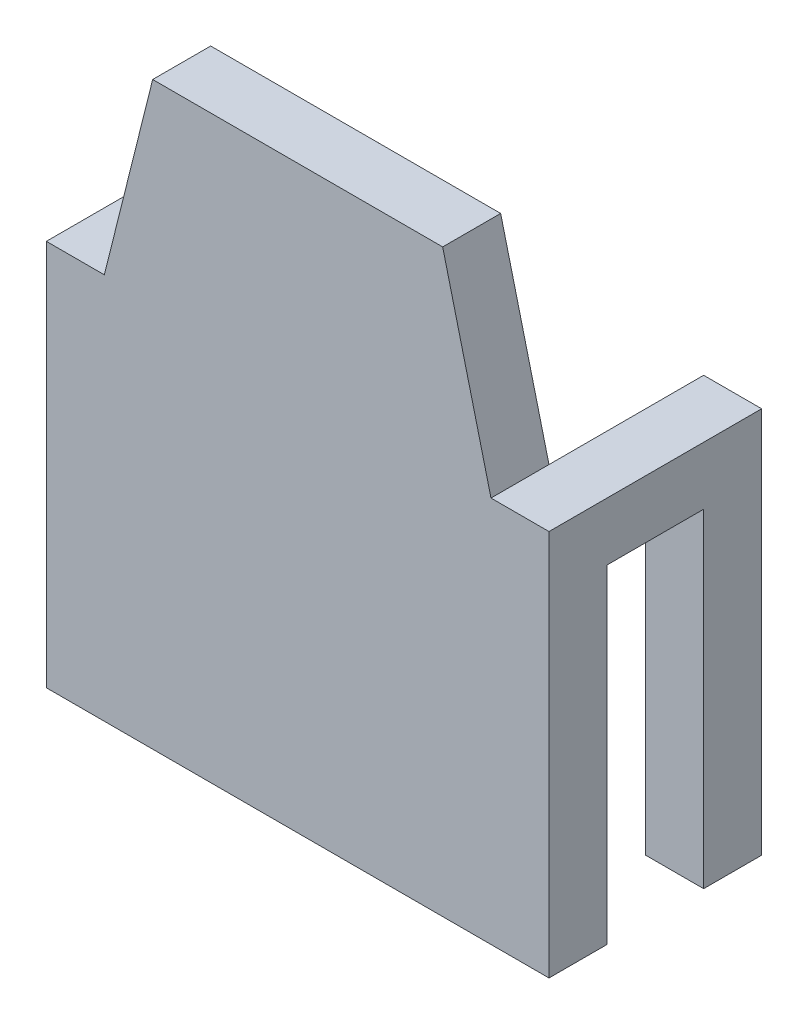
ISO-10303-21;
HEADER;
FILE_DESCRIPTION(('STEP AP214'),'2;1');
FILE_NAME('part.step','',(''),(''),'','','');
FILE_SCHEMA(('AUTOMOTIVE_DESIGN { 1 0 10303 214 1 1 1 1 }'));
ENDSEC;
DATA;
#1=APPLICATION_CONTEXT('core data for automotive mechanical design processes');
#2=APPLICATION_PROTOCOL_DEFINITION('international standard','automotive_design',2000,#1);
#3=PRODUCT_CONTEXT('',#1,'mechanical');
#4=PRODUCT('Part','Part','',(#3));
#5=PRODUCT_RELATED_PRODUCT_CATEGORY('part','',(#4));
#6=PRODUCT_DEFINITION_FORMATION('','',#4);
#7=PRODUCT_DEFINITION_CONTEXT('part definition',#1,'design');
#8=PRODUCT_DEFINITION('design','',#6,#7);
#9=PRODUCT_DEFINITION_SHAPE('','',#8);
#10=(LENGTH_UNIT() NAMED_UNIT(*) SI_UNIT(.MILLI.,.METRE.));
#11=(NAMED_UNIT(*) PLANE_ANGLE_UNIT() SI_UNIT($,.RADIAN.));
#12=(NAMED_UNIT(*) SI_UNIT($,.STERADIAN.) SOLID_ANGLE_UNIT());
#13=UNCERTAINTY_MEASURE_WITH_UNIT(LENGTH_MEASURE(1.E-05),#10,'distance_accuracy_value','');
#14=(GEOMETRIC_REPRESENTATION_CONTEXT(3) GLOBAL_UNCERTAINTY_ASSIGNED_CONTEXT((#13)) GLOBAL_UNIT_ASSIGNED_CONTEXT((#10,
#11,#12)) REPRESENTATION_CONTEXT('',''));
#15=CARTESIAN_POINT('',(0.,0.,0.));
#16=DIRECTION('',(0.,0.,1.));
#17=DIRECTION('',(1.,0.,0.));
#18=AXIS2_PLACEMENT_3D('',#15,#16,#17);
#19=CARTESIAN_POINT('',(23.,-13.,-8.));
#20=DIRECTION('',(0.,1.,0.));
#21=DIRECTION('',(0.,0.,1.));
#22=AXIS2_PLACEMENT_3D('',#19,#20,#21);
#23=PLANE('',#22);
#24=DIRECTION('',(-1.,0.,0.));
#25=VECTOR('',#24,1.);
#26=CARTESIAN_POINT('',(20.,-13.,-5.));
#27=LINE('',#26,#25);
#28=CARTESIAN_POINT('',(23.,-13.,-5.));
#29=VERTEX_POINT('',#28);
#30=CARTESIAN_POINT('',(20.,-13.,-5.));
#31=VERTEX_POINT('',#30);
#32=EDGE_CURVE('E165',#29,#31,#27,.T.);
#33=ORIENTED_EDGE('',*,*,#32,.F.);
#34=DIRECTION('',(0.,0.,1.));
#35=VECTOR('',#34,1.);
#36=CARTESIAN_POINT('',(23.,-13.,-8.));
#37=LINE('',#36,#35);
#38=CARTESIAN_POINT('',(23.,-13.,0.));
#39=VERTEX_POINT('',#38);
#40=EDGE_CURVE('E63',#29,#39,#37,.T.);
#41=ORIENTED_EDGE('',*,*,#40,.T.);
#42=DIRECTION('',(-1.,0.,0.));
#43=VECTOR('',#42,1.);
#44=CARTESIAN_POINT('',(23.,-13.,0.));
#45=LINE('',#44,#43);
#46=CARTESIAN_POINT('',(20.,-13.,0.));
#47=VERTEX_POINT('',#46);
#48=EDGE_CURVE('E294',#39,#47,#45,.T.);
#49=ORIENTED_EDGE('',*,*,#48,.T.);
#50=DIRECTION('',(0.,0.,1.));
#51=VECTOR('',#50,1.);
#52=CARTESIAN_POINT('',(20.,-13.,-8.));
#53=LINE('',#52,#51);
#54=EDGE_CURVE('E173',#31,#47,#53,.T.);
#55=ORIENTED_EDGE('',*,*,#54,.F.);
#56=EDGE_LOOP('',(#33,#41,#49,#55));
#57=FACE_BOUND('',#56,.T.);
#58=ADVANCED_FACE('F39',(#57),#23,.F.);
#59=CARTESIAN_POINT('',(-3.,-13.,-8.));
#60=DIRECTION('',(0.,1.,0.));
#61=DIRECTION('',(0.,0.,1.));
#62=AXIS2_PLACEMENT_3D('',#59,#60,#61);
#63=PLANE('',#62);
#64=DIRECTION('',(-1.,0.,0.));
#65=VECTOR('',#64,1.);
#66=CARTESIAN_POINT('',(-3.,-13.,-5.));
#67=LINE('',#66,#65);
#68=CARTESIAN_POINT('',(0.,-13.,-5.));
#69=VERTEX_POINT('',#68);
#70=CARTESIAN_POINT('',(-3.,-13.,-5.));
#71=VERTEX_POINT('',#70);
#72=EDGE_CURVE('E350',#69,#71,#67,.T.);
#73=ORIENTED_EDGE('',*,*,#72,.F.);
#74=DIRECTION('',(0.,0.,1.));
#75=VECTOR('',#74,1.);
#76=CARTESIAN_POINT('',(0.,-13.,-8.));
#77=LINE('',#76,#75);
#78=CARTESIAN_POINT('',(0.,-13.,0.));
#79=VERTEX_POINT('',#78);
#80=EDGE_CURVE('E288',#69,#79,#77,.T.);
#81=ORIENTED_EDGE('',*,*,#80,.T.);
#82=DIRECTION('',(-1.,0.,0.));
#83=VECTOR('',#82,1.);
#84=CARTESIAN_POINT('',(-3.,-13.,0.));
#85=LINE('',#84,#83);
#86=CARTESIAN_POINT('',(-3.,-13.,0.));
#87=VERTEX_POINT('',#86);
#88=EDGE_CURVE('E269',#79,#87,#85,.T.);
#89=ORIENTED_EDGE('',*,*,#88,.T.);
#90=DIRECTION('',(0.,0.,1.));
#91=VECTOR('',#90,1.);
#92=CARTESIAN_POINT('',(-3.,-13.,-8.));
#93=LINE('',#92,#91);
#94=EDGE_CURVE('E55',#71,#87,#93,.T.);
#95=ORIENTED_EDGE('',*,*,#94,.F.);
#96=EDGE_LOOP('',(#73,#81,#89,#95));
#97=FACE_BOUND('',#96,.T.);
#98=ADVANCED_FACE('F415',(#97),#63,.F.);
#99=CARTESIAN_POINT('',(0.,0.,0.));
#100=DIRECTION('',(0.,0.,1.));
#101=DIRECTION('',(1.,0.,0.));
#102=AXIS2_PLACEMENT_3D('',#99,#100,#101);
#103=PLANE('',#102);
#104=CARTESIAN_POINT('',(10.,-20.,0.));
#105=DIRECTION('',(0.,0.,-1.));
#106=DIRECTION('',(-1.,0.,0.));
#107=AXIS2_PLACEMENT_3D('',#104,#105,#106);
#108=CIRCLE('',#107,5.);
#109=CARTESIAN_POINT('',(5.,-20.,0.));
#110=VERTEX_POINT('',#109);
#111=EDGE_CURVE('E346',#110,#110,#108,.T.);
#112=ORIENTED_EDGE('',*,*,#111,.F.);
#113=EDGE_LOOP('',(#112));
#114=FACE_BOUND('',#113,.T.);
#115=DIRECTION('',(0.,-1.,0.));
#116=VECTOR('',#115,1.);
#117=CARTESIAN_POINT('',(0.,-10.,0.));
#118=LINE('',#117,#116);
#119=CARTESIAN_POINT('',(0.,-10.,0.));
#120=VERTEX_POINT('',#119);
#121=EDGE_CURVE('E267',#120,#79,#118,.T.);
#122=ORIENTED_EDGE('',*,*,#121,.F.);
#123=DIRECTION('',(-0.242535625036333,-0.970142500145332,0.));
#124=VECTOR('',#123,1.);
#125=CARTESIAN_POINT('',(2.5,0.,0.));
#126=LINE('',#125,#124);
#127=CARTESIAN_POINT('',(2.5,0.,0.));
#128=VERTEX_POINT('',#127);
#129=EDGE_CURVE('E222',#128,#120,#126,.T.);
#130=ORIENTED_EDGE('',*,*,#129,.F.);
#131=DIRECTION('',(-1.,0.,0.));
#132=VECTOR('',#131,1.);
#133=CARTESIAN_POINT('',(2.5,0.,0.));
#134=LINE('',#133,#132);
#135=CARTESIAN_POINT('',(17.5,0.,0.));
#136=VERTEX_POINT('',#135);
#137=EDGE_CURVE('E188',#136,#128,#134,.T.);
#138=ORIENTED_EDGE('',*,*,#137,.F.);
#139=DIRECTION('',(-0.242535625036333,0.970142500145332,0.));
#140=VECTOR('',#139,1.);
#141=CARTESIAN_POINT('',(17.5,0.,0.));
#142=LINE('',#141,#140);
#143=CARTESIAN_POINT('',(20.,-10.,0.));
#144=VERTEX_POINT('',#143);
#145=EDGE_CURVE('E183',#144,#136,#142,.T.);
#146=ORIENTED_EDGE('',*,*,#145,.F.);
#147=DIRECTION('',(0.,1.,0.));
#148=VECTOR('',#147,1.);
#149=CARTESIAN_POINT('',(20.,-10.,0.));
#150=LINE('',#149,#148);
#151=EDGE_CURVE('E299',#47,#144,#150,.T.);
#152=ORIENTED_EDGE('',*,*,#151,.F.);
#153=ORIENTED_EDGE('',*,*,#48,.F.);
#154=DIRECTION('',(0.,1.,0.));
#155=VECTOR('',#154,1.);
#156=CARTESIAN_POINT('',(23.,-10.,0.));
#157=LINE('',#156,#155);
#158=CARTESIAN_POINT('',(23.,-30.,0.));
#159=VERTEX_POINT('',#158);
#160=EDGE_CURVE('E181',#159,#39,#157,.T.);
#161=ORIENTED_EDGE('',*,*,#160,.F.);
#162=DIRECTION('',(1.,0.,0.));
#163=VECTOR('',#162,1.);
#164=CARTESIAN_POINT('',(23.,-30.,0.));
#165=LINE('',#164,#163);
#166=CARTESIAN_POINT('',(-3.,-30.,0.));
#167=VERTEX_POINT('',#166);
#168=EDGE_CURVE('E229',#167,#159,#165,.T.);
#169=ORIENTED_EDGE('',*,*,#168,.F.);
#170=DIRECTION('',(0.,-1.,0.));
#171=VECTOR('',#170,1.);
#172=CARTESIAN_POINT('',(-3.,-10.,0.));
#173=LINE('',#172,#171);
#174=EDGE_CURVE('E226',#87,#167,#173,.T.);
#175=ORIENTED_EDGE('',*,*,#174,.F.);
#176=ORIENTED_EDGE('',*,*,#88,.F.);
#177=EDGE_LOOP('',(#122,#130,#138,#146,#152,#153,#161,#169,#175,#176));
#178=FACE_BOUND('',#177,.T.);
#179=ADVANCED_FACE('F263',(#114,#178),#103,.F.);
#180=CARTESIAN_POINT('',(17.5,0.,3.));
#181=DIRECTION('',(-0.970142500145332,-0.242535625036333,0.));
#182=DIRECTION('',(0.242535625036333,-0.970142500145332,0.));
#183=AXIS2_PLACEMENT_3D('',#180,#181,#182);
#184=PLANE('',#183);
#185=ORIENTED_EDGE('',*,*,#145,.T.);
#186=DIRECTION('',(0.,0.,-1.));
#187=VECTOR('',#186,1.);
#188=CARTESIAN_POINT('',(17.5,0.,3.));
#189=LINE('',#188,#187);
#190=CARTESIAN_POINT('',(17.5,0.,3.));
#191=VERTEX_POINT('',#190);
#192=EDGE_CURVE('E11',#191,#136,#189,.T.);
#193=ORIENTED_EDGE('',*,*,#192,.F.);
#194=DIRECTION('',(-0.242535625036333,0.970142500145332,0.));
#195=VECTOR('',#194,1.);
#196=CARTESIAN_POINT('',(17.5,0.,3.));
#197=LINE('',#196,#195);
#198=CARTESIAN_POINT('',(20.,-10.,3.));
#199=VERTEX_POINT('',#198);
#200=EDGE_CURVE('E194',#199,#191,#197,.T.);
#201=ORIENTED_EDGE('',*,*,#200,.F.);
#202=DIRECTION('',(0.,0.,-1.));
#203=VECTOR('',#202,1.);
#204=CARTESIAN_POINT('',(20.,-10.,3.));
#205=LINE('',#204,#203);
#206=EDGE_CURVE('E218',#199,#144,#205,.T.);
#207=ORIENTED_EDGE('',*,*,#206,.T.);
#208=EDGE_LOOP('',(#185,#193,#201,#207));
#209=FACE_BOUND('',#208,.T.);
#210=ADVANCED_FACE('F41',(#209),#184,.F.);
#211=CARTESIAN_POINT('',(2.5,0.,3.));
#212=DIRECTION('',(0.,-1.,0.));
#213=DIRECTION('',(0.,0.,-1.));
#214=AXIS2_PLACEMENT_3D('',#211,#212,#213);
#215=PLANE('',#214);
#216=ORIENTED_EDGE('',*,*,#137,.T.);
#217=DIRECTION('',(0.,0.,-1.));
#218=VECTOR('',#217,1.);
#219=CARTESIAN_POINT('',(2.5,0.,3.));
#220=LINE('',#219,#218);
#221=CARTESIAN_POINT('',(2.5,0.,3.));
#222=VERTEX_POINT('',#221);
#223=EDGE_CURVE('E48',#222,#128,#220,.T.);
#224=ORIENTED_EDGE('',*,*,#223,.F.);
#225=DIRECTION('',(-1.,0.,0.));
#226=VECTOR('',#225,1.);
#227=CARTESIAN_POINT('',(2.5,0.,3.));
#228=LINE('',#227,#226);
#229=EDGE_CURVE('E198',#191,#222,#228,.T.);
#230=ORIENTED_EDGE('',*,*,#229,.F.);
#231=ORIENTED_EDGE('',*,*,#192,.T.);
#232=EDGE_LOOP('',(#216,#224,#230,#231));
#233=FACE_BOUND('',#232,.T.);
#234=ADVANCED_FACE('F573',(#233),#215,.F.);
#235=CARTESIAN_POINT('',(2.5,0.,3.));
#236=DIRECTION('',(0.970142500145332,-0.242535625036333,0.));
#237=DIRECTION('',(0.242535625036333,0.970142500145332,0.));
#238=AXIS2_PLACEMENT_3D('',#235,#236,#237);
#239=PLANE('',#238);
#240=ORIENTED_EDGE('',*,*,#129,.T.);
#241=DIRECTION('',(0.,0.,-1.));
#242=VECTOR('',#241,1.);
#243=CARTESIAN_POINT('',(0.,-10.,3.));
#244=LINE('',#243,#242);
#245=CARTESIAN_POINT('',(0.,-10.,3.));
#246=VERTEX_POINT('',#245);
#247=EDGE_CURVE('E249',#246,#120,#244,.T.);
#248=ORIENTED_EDGE('',*,*,#247,.F.);
#249=DIRECTION('',(-0.242535625036333,-0.970142500145332,0.));
#250=VECTOR('',#249,1.);
#251=CARTESIAN_POINT('',(2.5,0.,3.));
#252=LINE('',#251,#250);
#253=EDGE_CURVE('E201',#222,#246,#252,.T.);
#254=ORIENTED_EDGE('',*,*,#253,.F.);
#255=ORIENTED_EDGE('',*,*,#223,.T.);
#256=EDGE_LOOP('',(#240,#248,#254,#255));
#257=FACE_BOUND('',#256,.T.);
#258=ADVANCED_FACE('F258',(#257),#239,.F.);
#259=CARTESIAN_POINT('',(0.,-10.,3.));
#260=DIRECTION('',(0.,-1.,0.));
#261=DIRECTION('',(0.,0.,-1.));
#262=AXIS2_PLACEMENT_3D('',#259,#260,#261);
#263=PLANE('',#262);
#264=ORIENTED_EDGE('',*,*,#247,.T.);
#265=DIRECTION('',(0.,0.,1.));
#266=VECTOR('',#265,1.);
#267=CARTESIAN_POINT('',(0.,-10.,-8.));
#268=LINE('',#267,#266);
#269=CARTESIAN_POINT('',(0.,-10.,-8.));
#270=VERTEX_POINT('',#269);
#271=EDGE_CURVE('E291',#270,#120,#268,.T.);
#272=ORIENTED_EDGE('',*,*,#271,.F.);
#273=DIRECTION('',(1.,0.,0.));
#274=VECTOR('',#273,1.);
#275=CARTESIAN_POINT('',(-3.,-10.,-8.));
#276=LINE('',#275,#274);
#277=CARTESIAN_POINT('',(-3.,-10.,-8.));
#278=VERTEX_POINT('',#277);
#279=EDGE_CURVE('E376',#278,#270,#276,.T.);
#280=ORIENTED_EDGE('',*,*,#279,.F.);
#281=DIRECTION('',(0.,0.,-1.));
#282=VECTOR('',#281,1.);
#283=CARTESIAN_POINT('',(-3.,-10.,3.));
#284=LINE('',#283,#282);
#285=CARTESIAN_POINT('',(-3.,-10.,3.));
#286=VERTEX_POINT('',#285);
#287=EDGE_CURVE('E246',#286,#278,#284,.T.);
#288=ORIENTED_EDGE('',*,*,#287,.F.);
#289=DIRECTION('',(-1.,0.,0.));
#290=VECTOR('',#289,1.);
#291=CARTESIAN_POINT('',(0.,-10.,3.));
#292=LINE('',#291,#290);
#293=EDGE_CURVE('E204',#246,#286,#292,.T.);
#294=ORIENTED_EDGE('',*,*,#293,.F.);
#295=EDGE_LOOP('',(#264,#272,#280,#288,#294));
#296=FACE_BOUND('',#295,.T.);
#297=ADVANCED_FACE('F400',(#296),#263,.F.);
#298=CARTESIAN_POINT('',(-3.,-10.,3.));
#299=DIRECTION('',(1.,0.,0.));
#300=DIRECTION('',(0.,1.,0.));
#301=AXIS2_PLACEMENT_3D('',#298,#299,#300);
#302=PLANE('',#301);
#303=ORIENTED_EDGE('',*,*,#287,.T.);
#304=DIRECTION('',(0.,1.,0.));
#305=VECTOR('',#304,1.);
#306=CARTESIAN_POINT('',(-3.,-10.,-8.));
#307=LINE('',#306,#305);
#308=CARTESIAN_POINT('',(-3.,-30.,-8.));
#309=VERTEX_POINT('',#308);
#310=EDGE_CURVE('E277',#309,#278,#307,.T.);
#311=ORIENTED_EDGE('',*,*,#310,.F.);
#312=DIRECTION('',(0.,0.,1.));
#313=VECTOR('',#312,1.);
#314=CARTESIAN_POINT('',(-3.,-30.,-8.));
#315=LINE('',#314,#313);
#316=CARTESIAN_POINT('',(-3.,-30.,-5.));
#317=VERTEX_POINT('',#316);
#318=EDGE_CURVE('E273',#309,#317,#315,.T.);
#319=ORIENTED_EDGE('',*,*,#318,.T.);
#320=DIRECTION('',(0.,1.,0.));
#321=VECTOR('',#320,1.);
#322=CARTESIAN_POINT('',(-3.,-34.2426406871193,-5.));
#323=LINE('',#322,#321);
#324=EDGE_CURVE('E365',#317,#71,#323,.T.);
#325=ORIENTED_EDGE('',*,*,#324,.T.);
#326=ORIENTED_EDGE('',*,*,#94,.T.);
#327=ORIENTED_EDGE('',*,*,#174,.T.);
#328=DIRECTION('',(0.,0.,-1.));
#329=VECTOR('',#328,1.);
#330=CARTESIAN_POINT('',(-3.,-30.,3.));
#331=LINE('',#330,#329);
#332=CARTESIAN_POINT('',(-3.,-30.,3.));
#333=VERTEX_POINT('',#332);
#334=EDGE_CURVE('E242',#333,#167,#331,.T.);
#335=ORIENTED_EDGE('',*,*,#334,.F.);
#336=DIRECTION('',(0.,-1.,0.));
#337=VECTOR('',#336,1.);
#338=CARTESIAN_POINT('',(-3.,-10.,3.));
#339=LINE('',#338,#337);
#340=EDGE_CURVE('E207',#286,#333,#339,.T.);
#341=ORIENTED_EDGE('',*,*,#340,.F.);
#342=EDGE_LOOP('',(#303,#311,#319,#325,#326,#327,#335,#341));
#343=FACE_BOUND('',#342,.T.);
#344=ADVANCED_FACE('F394',(#343),#302,.F.);
#345=CARTESIAN_POINT('',(23.,-30.,3.));
#346=DIRECTION('',(0.,1.,0.));
#347=DIRECTION('',(0.,0.,1.));
#348=AXIS2_PLACEMENT_3D('',#345,#346,#347);
#349=PLANE('',#348);
#350=ORIENTED_EDGE('',*,*,#168,.T.);
#351=DIRECTION('',(0.,0.,-1.));
#352=VECTOR('',#351,1.);
#353=CARTESIAN_POINT('',(23.,-30.,3.));
#354=LINE('',#353,#352);
#355=CARTESIAN_POINT('',(23.,-30.,3.));
#356=VERTEX_POINT('',#355);
#357=EDGE_CURVE('E239',#356,#159,#354,.T.);
#358=ORIENTED_EDGE('',*,*,#357,.F.);
#359=DIRECTION('',(1.,0.,0.));
#360=VECTOR('',#359,1.);
#361=CARTESIAN_POINT('',(-3.,-30.,3.));
#362=LINE('',#361,#360);
#363=EDGE_CURVE('E210',#333,#356,#362,.T.);
#364=ORIENTED_EDGE('',*,*,#363,.F.);
#365=ORIENTED_EDGE('',*,*,#334,.T.);
#366=EDGE_LOOP('',(#350,#358,#364,#365));
#367=FACE_BOUND('',#366,.T.);
#368=ADVANCED_FACE('F405',(#367),#349,.F.);
#369=CARTESIAN_POINT('',(23.,-10.,3.));
#370=DIRECTION('',(-1.,0.,0.));
#371=DIRECTION('',(0.,-1.,0.));
#372=AXIS2_PLACEMENT_3D('',#369,#370,#371);
#373=PLANE('',#372);
#374=ORIENTED_EDGE('',*,*,#160,.T.);
#375=ORIENTED_EDGE('',*,*,#40,.F.);
#376=DIRECTION('',(0.,1.,0.));
#377=VECTOR('',#376,1.);
#378=CARTESIAN_POINT('',(23.,-34.2426406871193,-5.));
#379=LINE('',#378,#377);
#380=CARTESIAN_POINT('',(23.,-30.,-5.));
#381=VERTEX_POINT('',#380);
#382=EDGE_CURVE('E162',#381,#29,#379,.T.);
#383=ORIENTED_EDGE('',*,*,#382,.F.);
#384=DIRECTION('',(0.,0.,-1.));
#385=VECTOR('',#384,1.);
#386=CARTESIAN_POINT('',(23.,-30.,-8.));
#387=LINE('',#386,#385);
#388=CARTESIAN_POINT('',(23.,-30.,-8.));
#389=VERTEX_POINT('',#388);
#390=EDGE_CURVE('E335',#381,#389,#387,.T.);
#391=ORIENTED_EDGE('',*,*,#390,.T.);
#392=DIRECTION('',(0.,-1.,0.));
#393=VECTOR('',#392,1.);
#394=CARTESIAN_POINT('',(23.,-10.,-8.));
#395=LINE('',#394,#393);
#396=CARTESIAN_POINT('',(23.,-10.,-8.));
#397=VERTEX_POINT('',#396);
#398=EDGE_CURVE('E295',#397,#389,#395,.T.);
#399=ORIENTED_EDGE('',*,*,#398,.F.);
#400=DIRECTION('',(0.,0.,-1.));
#401=VECTOR('',#400,1.);
#402=CARTESIAN_POINT('',(23.,-10.,3.));
#403=LINE('',#402,#401);
#404=CARTESIAN_POINT('',(23.,-10.,3.));
#405=VERTEX_POINT('',#404);
#406=EDGE_CURVE('E236',#405,#397,#403,.T.);
#407=ORIENTED_EDGE('',*,*,#406,.F.);
#408=DIRECTION('',(0.,1.,0.));
#409=VECTOR('',#408,1.);
#410=CARTESIAN_POINT('',(23.,-10.,3.));
#411=LINE('',#410,#409);
#412=EDGE_CURVE('E213',#356,#405,#411,.T.);
#413=ORIENTED_EDGE('',*,*,#412,.F.);
#414=ORIENTED_EDGE('',*,*,#357,.T.);
#415=EDGE_LOOP('',(#374,#375,#383,#391,#399,#407,#413,#414));
#416=FACE_BOUND('',#415,.T.);
#417=ADVANCED_FACE('F178',(#416),#373,.F.);
#418=CARTESIAN_POINT('',(20.,-10.,3.));
#419=DIRECTION('',(0.,-1.,0.));
#420=DIRECTION('',(0.,0.,-1.));
#421=AXIS2_PLACEMENT_3D('',#418,#419,#420);
#422=PLANE('',#421);
#423=ORIENTED_EDGE('',*,*,#406,.T.);
#424=DIRECTION('',(1.,0.,0.));
#425=VECTOR('',#424,1.);
#426=CARTESIAN_POINT('',(23.,-10.,-8.));
#427=LINE('',#426,#425);
#428=CARTESIAN_POINT('',(20.,-10.,-8.));
#429=VERTEX_POINT('',#428);
#430=EDGE_CURVE('E302',#429,#397,#427,.T.);
#431=ORIENTED_EDGE('',*,*,#430,.F.);
#432=DIRECTION('',(0.,0.,1.));
#433=VECTOR('',#432,1.);
#434=CARTESIAN_POINT('',(20.,-10.,-8.));
#435=LINE('',#434,#433);
#436=EDGE_CURVE('E190',#429,#144,#435,.T.);
#437=ORIENTED_EDGE('',*,*,#436,.T.);
#438=ORIENTED_EDGE('',*,*,#206,.F.);
#439=DIRECTION('',(-1.,0.,0.));
#440=VECTOR('',#439,1.);
#441=CARTESIAN_POINT('',(20.,-10.,3.));
#442=LINE('',#441,#440);
#443=EDGE_CURVE('E216',#405,#199,#442,.T.);
#444=ORIENTED_EDGE('',*,*,#443,.F.);
#445=EDGE_LOOP('',(#423,#431,#437,#438,#444));
#446=FACE_BOUND('',#445,.T.);
#447=ADVANCED_FACE('F316',(#446),#422,.F.);
#448=CARTESIAN_POINT('',(0.,0.,3.));
#449=DIRECTION('',(0.,0.,1.));
#450=DIRECTION('',(1.,0.,0.));
#451=AXIS2_PLACEMENT_3D('',#448,#449,#450);
#452=PLANE('',#451);
#453=ORIENTED_EDGE('',*,*,#200,.T.);
#454=ORIENTED_EDGE('',*,*,#229,.T.);
#455=ORIENTED_EDGE('',*,*,#253,.T.);
#456=ORIENTED_EDGE('',*,*,#293,.T.);
#457=ORIENTED_EDGE('',*,*,#340,.T.);
#458=ORIENTED_EDGE('',*,*,#363,.T.);
#459=ORIENTED_EDGE('',*,*,#412,.T.);
#460=ORIENTED_EDGE('',*,*,#443,.T.);
#461=EDGE_LOOP('',(#453,#454,#455,#456,#457,#458,#459,#460));
#462=FACE_BOUND('',#461,.T.);
#463=ADVANCED_FACE('F327',(#462),#452,.T.);
#464=CARTESIAN_POINT('',(20.,-10.,-8.));
#465=DIRECTION('',(1.,0.,0.));
#466=DIRECTION('',(0.,0.,-1.));
#467=AXIS2_PLACEMENT_3D('',#464,#465,#466);
#468=PLANE('',#467);
#469=ORIENTED_EDGE('',*,*,#151,.T.);
#470=ORIENTED_EDGE('',*,*,#436,.F.);
#471=DIRECTION('',(0.,1.,0.));
#472=VECTOR('',#471,1.);
#473=CARTESIAN_POINT('',(20.,-10.,-8.));
#474=LINE('',#473,#472);
#475=CARTESIAN_POINT('',(20.,-30.,-8.));
#476=VERTEX_POINT('',#475);
#477=EDGE_CURVE('E298',#476,#429,#474,.T.);
#478=ORIENTED_EDGE('',*,*,#477,.F.);
#479=DIRECTION('',(0.,0.,1.));
#480=VECTOR('',#479,1.);
#481=CARTESIAN_POINT('',(20.,-30.,-8.));
#482=LINE('',#481,#480);
#483=CARTESIAN_POINT('',(20.,-30.,-5.));
#484=VERTEX_POINT('',#483);
#485=EDGE_CURVE('E342',#476,#484,#482,.T.);
#486=ORIENTED_EDGE('',*,*,#485,.T.);
#487=DIRECTION('',(0.,1.,0.));
#488=VECTOR('',#487,1.);
#489=CARTESIAN_POINT('',(20.,-34.2426406871193,-5.));
#490=LINE('',#489,#488);
#491=EDGE_CURVE('E171',#484,#31,#490,.T.);
#492=ORIENTED_EDGE('',*,*,#491,.T.);
#493=ORIENTED_EDGE('',*,*,#54,.T.);
#494=EDGE_LOOP('',(#469,#470,#478,#486,#492,#493));
#495=FACE_BOUND('',#494,.T.);
#496=ADVANCED_FACE('F320',(#495),#468,.F.);
#497=CARTESIAN_POINT('',(0.,0.,-8.));
#498=DIRECTION('',(0.,0.,-1.));
#499=DIRECTION('',(-1.,0.,0.));
#500=AXIS2_PLACEMENT_3D('',#497,#498,#499);
#501=PLANE('',#500);
#502=ORIENTED_EDGE('',*,*,#398,.T.);
#503=DIRECTION('',(-1.,0.,0.));
#504=VECTOR('',#503,1.);
#505=CARTESIAN_POINT('',(20.,-30.,-8.));
#506=LINE('',#505,#504);
#507=EDGE_CURVE('E338',#389,#476,#506,.T.);
#508=ORIENTED_EDGE('',*,*,#507,.T.);
#509=ORIENTED_EDGE('',*,*,#477,.T.);
#510=ORIENTED_EDGE('',*,*,#430,.T.);
#511=EDGE_LOOP('',(#502,#508,#509,#510));
#512=FACE_BOUND('',#511,.T.);
#513=ADVANCED_FACE('F332',(#512),#501,.T.);
#514=CARTESIAN_POINT('',(0.,-10.,-8.));
#515=DIRECTION('',(-1.,0.,0.));
#516=DIRECTION('',(0.,-1.,0.));
#517=AXIS2_PLACEMENT_3D('',#514,#515,#516);
#518=PLANE('',#517);
#519=ORIENTED_EDGE('',*,*,#121,.T.);
#520=ORIENTED_EDGE('',*,*,#80,.F.);
#521=DIRECTION('',(0.,1.,0.));
#522=VECTOR('',#521,1.);
#523=CARTESIAN_POINT('',(0.,-34.2426406871193,-5.));
#524=LINE('',#523,#522);
#525=CARTESIAN_POINT('',(0.,-30.,-5.));
#526=VERTEX_POINT('',#525);
#527=EDGE_CURVE('E368',#526,#69,#524,.T.);
#528=ORIENTED_EDGE('',*,*,#527,.F.);
#529=DIRECTION('',(0.,0.,-1.));
#530=VECTOR('',#529,1.);
#531=CARTESIAN_POINT('',(0.,-30.,-8.));
#532=LINE('',#531,#530);
#533=CARTESIAN_POINT('',(0.,-30.,-8.));
#534=VERTEX_POINT('',#533);
#535=EDGE_CURVE('E354',#526,#534,#532,.T.);
#536=ORIENTED_EDGE('',*,*,#535,.T.);
#537=DIRECTION('',(0.,-1.,0.));
#538=VECTOR('',#537,1.);
#539=CARTESIAN_POINT('',(0.,-10.,-8.));
#540=LINE('',#539,#538);
#541=EDGE_CURVE('E283',#270,#534,#540,.T.);
#542=ORIENTED_EDGE('',*,*,#541,.F.);
#543=ORIENTED_EDGE('',*,*,#271,.T.);
#544=EDGE_LOOP('',(#519,#520,#528,#536,#542,#543));
#545=FACE_BOUND('',#544,.T.);
#546=ADVANCED_FACE('F389',(#545),#518,.F.);
#547=CARTESIAN_POINT('',(0.,0.,-8.));
#548=DIRECTION('',(0.,0.,1.));
#549=DIRECTION('',(1.,0.,0.));
#550=AXIS2_PLACEMENT_3D('',#547,#548,#549);
#551=PLANE('',#550);
#552=ORIENTED_EDGE('',*,*,#310,.T.);
#553=ORIENTED_EDGE('',*,*,#279,.T.);
#554=ORIENTED_EDGE('',*,*,#541,.T.);
#555=DIRECTION('',(-1.,0.,0.));
#556=VECTOR('',#555,1.);
#557=CARTESIAN_POINT('',(-3.,-30.,-8.));
#558=LINE('',#557,#556);
#559=EDGE_CURVE('E280',#534,#309,#558,.T.);
#560=ORIENTED_EDGE('',*,*,#559,.T.);
#561=EDGE_LOOP('',(#552,#553,#554,#560));
#562=FACE_BOUND('',#561,.T.);
#563=ADVANCED_FACE('F384',(#562),#551,.F.);
#564=CARTESIAN_POINT('',(-3.,-34.2426406871193,-5.));
#565=DIRECTION('',(0.,0.,-1.));
#566=DIRECTION('',(-1.,0.,0.));
#567=AXIS2_PLACEMENT_3D('',#564,#565,#566);
#568=PLANE('',#567);
#569=ORIENTED_EDGE('',*,*,#324,.F.);
#570=DIRECTION('',(1.,0.,0.));
#571=VECTOR('',#570,1.);
#572=CARTESIAN_POINT('',(-3.,-30.,-5.));
#573=LINE('',#572,#571);
#574=EDGE_CURVE('E358',#317,#526,#573,.T.);
#575=ORIENTED_EDGE('',*,*,#574,.T.);
#576=ORIENTED_EDGE('',*,*,#527,.T.);
#577=ORIENTED_EDGE('',*,*,#72,.T.);
#578=EDGE_LOOP('',(#569,#575,#576,#577));
#579=FACE_BOUND('',#578,.T.);
#580=ADVANCED_FACE('F393',(#579),#568,.F.);
#581=CARTESIAN_POINT('',(23.,-30.,3.));
#582=DIRECTION('',(0.,1.,0.));
#583=DIRECTION('',(0.,0.,1.));
#584=AXIS2_PLACEMENT_3D('',#581,#582,#583);
#585=PLANE('',#584);
#586=ORIENTED_EDGE('',*,*,#559,.F.);
#587=ORIENTED_EDGE('',*,*,#535,.F.);
#588=ORIENTED_EDGE('',*,*,#574,.F.);
#589=ORIENTED_EDGE('',*,*,#318,.F.);
#590=EDGE_LOOP('',(#586,#587,#588,#589));
#591=FACE_BOUND('',#590,.T.);
#592=ADVANCED_FACE('F387',(#591),#585,.F.);
#593=CARTESIAN_POINT('',(20.,-34.2426406871193,-5.));
#594=DIRECTION('',(0.,0.,-1.));
#595=DIRECTION('',(-1.,0.,0.));
#596=AXIS2_PLACEMENT_3D('',#593,#594,#595);
#597=PLANE('',#596);
#598=ORIENTED_EDGE('',*,*,#491,.F.);
#599=DIRECTION('',(1.,0.,0.));
#600=VECTOR('',#599,1.);
#601=CARTESIAN_POINT('',(20.,-30.,-5.));
#602=LINE('',#601,#600);
#603=EDGE_CURVE('E167',#484,#381,#602,.T.);
#604=ORIENTED_EDGE('',*,*,#603,.T.);
#605=ORIENTED_EDGE('',*,*,#382,.T.);
#606=ORIENTED_EDGE('',*,*,#32,.T.);
#607=EDGE_LOOP('',(#598,#604,#605,#606));
#608=FACE_BOUND('',#607,.T.);
#609=ADVANCED_FACE('F164',(#608),#597,.F.);
#610=CARTESIAN_POINT('',(23.,-30.,3.));
#611=DIRECTION('',(0.,1.,0.));
#612=DIRECTION('',(0.,0.,1.));
#613=AXIS2_PLACEMENT_3D('',#610,#611,#612);
#614=PLANE('',#613);
#615=ORIENTED_EDGE('',*,*,#507,.F.);
#616=ORIENTED_EDGE('',*,*,#390,.F.);
#617=ORIENTED_EDGE('',*,*,#603,.F.);
#618=ORIENTED_EDGE('',*,*,#485,.F.);
#619=EDGE_LOOP('',(#615,#616,#617,#618));
#620=FACE_BOUND('',#619,.T.);
#621=ADVANCED_FACE('F481',(#620),#614,.F.);
#622=CARTESIAN_POINT('',(10.,-20.,2.));
#623=DIRECTION('',(0.,0.,-1.));
#624=DIRECTION('',(-1.,0.,0.));
#625=AXIS2_PLACEMENT_3D('',#622,#623,#624);
#626=CYLINDRICAL_SURFACE('',#625,5.);
#627=CARTESIAN_POINT('',(10.,-20.,2.));
#628=DIRECTION('',(0.,0.,-1.));
#629=DIRECTION('',(-1.,0.,0.));
#630=AXIS2_PLACEMENT_3D('',#627,#628,#629);
#631=CIRCLE('',#630,5.);
#632=CARTESIAN_POINT('',(5.,-20.,2.));
#633=VERTEX_POINT('',#632);
#634=EDGE_CURVE('E175',#633,#633,#631,.T.);
#635=ORIENTED_EDGE('',*,*,#634,.F.);
#636=EDGE_LOOP('',(#635));
#637=FACE_BOUND('',#636,.T.);
#638=ORIENTED_EDGE('',*,*,#111,.T.);
#639=EDGE_LOOP('',(#638));
#640=FACE_BOUND('',#639,.T.);
#641=ADVANCED_FACE('F488',(#637,#640),#626,.F.);
#642=CARTESIAN_POINT('',(10.,-20.,2.));
#643=DIRECTION('',(0.,0.,-1.));
#644=DIRECTION('',(-1.,0.,0.));
#645=AXIS2_PLACEMENT_3D('',#642,#643,#644);
#646=PLANE('',#645);
#647=ORIENTED_EDGE('',*,*,#634,.T.);
#648=EDGE_LOOP('',(#647));
#649=FACE_BOUND('',#648,.T.);
#650=ADVANCED_FACE('F496',(#649),#646,.T.);
#651=CLOSED_SHELL('',(#58,#98,#179,#210,#234,#258,#297,#344,#368,#417,#447,#463,#496,#513,#546,
#563,#580,#592,#609,#621,#641,#650));
#652=MANIFOLD_SOLID_BREP('B2',#651);
#653=ADVANCED_BREP_SHAPE_REPRESENTATION('',(#18,#652),#14);
#654=SHAPE_DEFINITION_REPRESENTATION(#9,#653);
ENDSEC;
END-ISO-10303-21;
